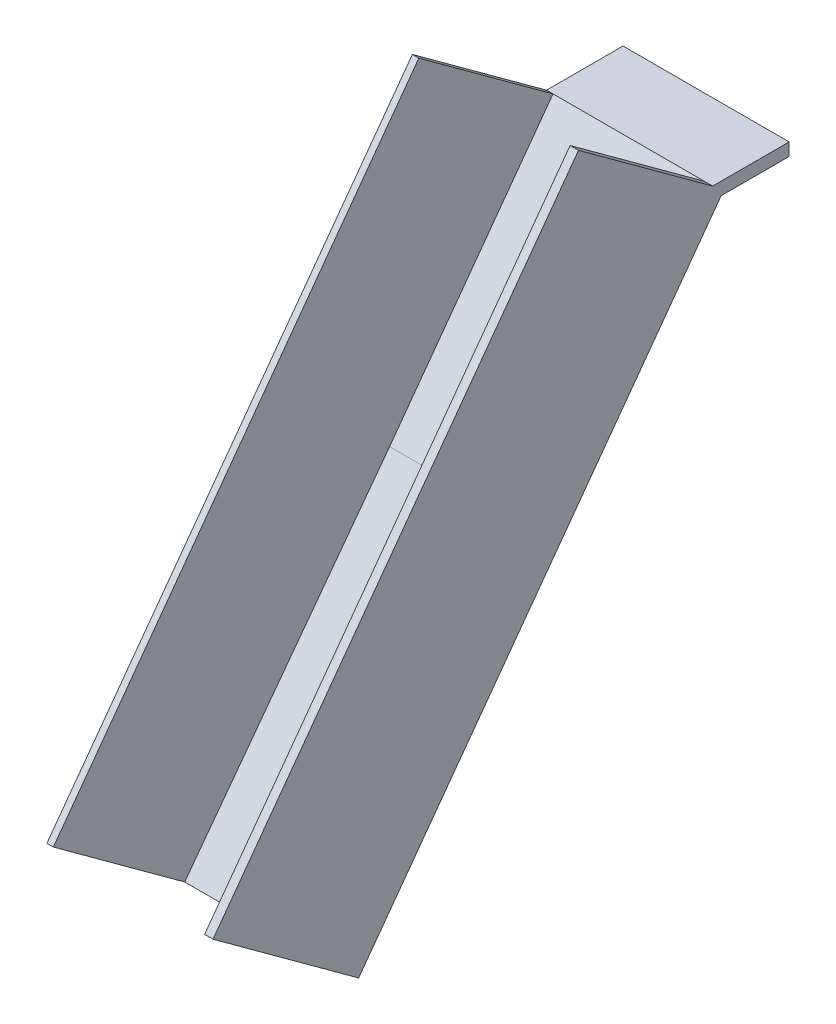
ISO-10303-21;
HEADER;
FILE_DESCRIPTION(('STEP AP214'),'2;1');
FILE_NAME('part.step','',(''),(''),'','','');
FILE_SCHEMA(('AUTOMOTIVE_DESIGN { 1 0 10303 214 1 1 1 1 }'));
ENDSEC;
DATA;
#1=APPLICATION_CONTEXT('core data for automotive mechanical design processes');
#2=APPLICATION_PROTOCOL_DEFINITION('international standard','automotive_design',2000,#1);
#3=PRODUCT_CONTEXT('',#1,'mechanical');
#4=PRODUCT('Part','Part','',(#3));
#5=PRODUCT_RELATED_PRODUCT_CATEGORY('part','',(#4));
#6=PRODUCT_DEFINITION_FORMATION('','',#4);
#7=PRODUCT_DEFINITION_CONTEXT('part definition',#1,'design');
#8=PRODUCT_DEFINITION('design','',#6,#7);
#9=PRODUCT_DEFINITION_SHAPE('','',#8);
#10=(LENGTH_UNIT() NAMED_UNIT(*) SI_UNIT(.MILLI.,.METRE.));
#11=(NAMED_UNIT(*) PLANE_ANGLE_UNIT() SI_UNIT($,.RADIAN.));
#12=(NAMED_UNIT(*) SI_UNIT($,.STERADIAN.) SOLID_ANGLE_UNIT());
#13=UNCERTAINTY_MEASURE_WITH_UNIT(LENGTH_MEASURE(1.E-05),#10,'distance_accuracy_value','');
#14=(GEOMETRIC_REPRESENTATION_CONTEXT(3) GLOBAL_UNCERTAINTY_ASSIGNED_CONTEXT((#13)) GLOBAL_UNIT_ASSIGNED_CONTEXT((#10,
#11,#12)) REPRESENTATION_CONTEXT('',''));
#15=CARTESIAN_POINT('',(0.,0.,0.));
#16=DIRECTION('',(0.,0.,1.));
#17=DIRECTION('',(1.,0.,0.));
#18=AXIS2_PLACEMENT_3D('',#15,#16,#17);
#19=CARTESIAN_POINT('',(40.,0.,0.));
#20=DIRECTION('',(0.,-0.58982616547506,-0.807530243719074));
#21=DIRECTION('',(0.,0.807530243719074,-0.58982616547506));
#22=AXIS2_PLACEMENT_3D('',#19,#20,#21);
#23=PLANE('',#22);
#24=DIRECTION('',(0.,-0.807530243719074,0.58982616547506));
#25=VECTOR('',#24,1.);
#26=CARTESIAN_POINT('',(37.9726991570541,53.8716928385524,-39.3482897535508));
#27=LINE('',#26,#25);
#28=CARTESIAN_POINT('',(37.9726991570541,53.8716928385524,-39.3482897535508));
#29=VERTEX_POINT('',#28);
#30=CARTESIAN_POINT('',(37.9726991570541,0.,0.));
#31=VERTEX_POINT('',#30);
#32=EDGE_CURVE('E53',#29,#31,#27,.T.);
#33=ORIENTED_EDGE('',*,*,#32,.F.);
#34=DIRECTION('',(-1.,0.,0.));
#35=VECTOR('',#34,1.);
#36=CARTESIAN_POINT('',(40.,53.8716928385524,-39.3482897535508));
#37=LINE('',#36,#35);
#38=CARTESIAN_POINT('',(1.56034219795234,53.8716928385524,-39.3482897535508));
#39=VERTEX_POINT('',#38);
#40=EDGE_CURVE('E201',#29,#39,#37,.T.);
#41=ORIENTED_EDGE('',*,*,#40,.T.);
#42=DIRECTION('',(0.,0.807530243719074,-0.58982616547506));
#43=VECTOR('',#42,1.);
#44=CARTESIAN_POINT('',(1.56034219795234,53.8716928385524,-39.3482897535508));
#45=LINE('',#44,#43);
#46=CARTESIAN_POINT('',(1.56034219795234,5.17585974080248E-10,-3.82093662265603E-10));
#47=VERTEX_POINT('',#46);
#48=EDGE_CURVE('E153',#47,#39,#45,.T.);
#49=ORIENTED_EDGE('',*,*,#48,.F.);
#50=DIRECTION('',(-1.,0.,0.));
#51=VECTOR('',#50,1.);
#52=CARTESIAN_POINT('',(40.,0.,0.));
#53=LINE('',#52,#51);
#54=EDGE_CURVE('E194',#31,#47,#53,.T.);
#55=ORIENTED_EDGE('',*,*,#54,.F.);
#56=EDGE_LOOP('',(#33,#41,#49,#55));
#57=FACE_BOUND('',#56,.T.);
#58=ADVANCED_FACE('F39',(#57),#23,.F.);
#59=CARTESIAN_POINT('',(40.,-66.1167171115945,49.3292310317726));
#60=DIRECTION('',(0.,-0.597994068346452,-0.801500526651392));
#61=DIRECTION('',(0.,0.801500526651392,-0.597994068346453));
#62=AXIS2_PLACEMENT_3D('',#59,#60,#61);
#63=PLANE('',#62);
#64=DIRECTION('',(0.,-0.801500526651392,0.597994068346453));
#65=VECTOR('',#64,1.);
#66=CARTESIAN_POINT('',(37.9726991570541,-66.1167171115945,49.3292310317726));
#67=LINE('',#66,#65);
#68=CARTESIAN_POINT('',(37.9726991570541,-66.1167171115945,49.3292310317726));
#69=VERTEX_POINT('',#68);
#70=EDGE_CURVE('E65',#31,#69,#67,.T.);
#71=ORIENTED_EDGE('',*,*,#70,.F.);
#72=ORIENTED_EDGE('',*,*,#54,.T.);
#73=DIRECTION('',(0.,0.801500526651392,-0.597994068346453));
#74=VECTOR('',#73,1.);
#75=CARTESIAN_POINT('',(1.56034219795234,-66.1167171115945,49.3292310317726));
#76=LINE('',#75,#74);
#77=CARTESIAN_POINT('',(1.56034219795234,-66.1167171115945,49.3292310317726));
#78=VERTEX_POINT('',#77);
#79=EDGE_CURVE('E11',#78,#47,#76,.T.);
#80=ORIENTED_EDGE('',*,*,#79,.F.);
#81=DIRECTION('',(-1.,0.,0.));
#82=VECTOR('',#81,1.);
#83=CARTESIAN_POINT('',(40.,-66.1167171115945,49.3292310317726));
#84=LINE('',#83,#82);
#85=EDGE_CURVE('E50',#69,#78,#84,.T.);
#86=ORIENTED_EDGE('',*,*,#85,.F.);
#87=EDGE_LOOP('',(#71,#72,#80,#86));
#88=FACE_BOUND('',#87,.T.);
#89=ADVANCED_FACE('F41',(#88),#63,.F.);
#90=CARTESIAN_POINT('',(40.,-68.6334443146076,45.8835830585487));
#91=DIRECTION('',(0.,0.807530243719074,-0.589826165475061));
#92=DIRECTION('',(0.,0.589826165475061,0.807530243719074));
#93=AXIS2_PLACEMENT_3D('',#90,#91,#92);
#94=PLANE('',#93);
#95=DIRECTION('',(-1.,0.,0.));
#96=VECTOR('',#95,1.);
#97=CARTESIAN_POINT('',(40.,-68.6334443146076,45.8835830585487));
#98=LINE('',#97,#96);
#99=CARTESIAN_POINT('',(40.,-68.6334443146076,45.8835830585487));
#100=VERTEX_POINT('',#99);
#101=CARTESIAN_POINT('',(0.,-68.6334443146076,45.8835830585487));
#102=VERTEX_POINT('',#101);
#103=EDGE_CURVE('E214',#100,#102,#98,.T.);
#104=ORIENTED_EDGE('',*,*,#103,.F.);
#105=DIRECTION('',(0.,-0.589826165475061,-0.807530243719074));
#106=VECTOR('',#105,1.);
#107=CARTESIAN_POINT('',(40.,-68.6334443146076,45.8835830585487));
#108=LINE('',#107,#106);
#109=CARTESIAN_POINT('',(40.,-43.0176358859097,80.9541533965514));
#110=VERTEX_POINT('',#109);
#111=EDGE_CURVE('E181',#110,#100,#108,.T.);
#112=ORIENTED_EDGE('',*,*,#111,.F.);
#113=DIRECTION('',(1.,0.,0.));
#114=VECTOR('',#113,1.);
#115=CARTESIAN_POINT('',(37.9726991570541,-43.0176358859097,80.9541533965514));
#116=LINE('',#115,#114);
#117=CARTESIAN_POINT('',(37.9726991570541,-43.0176358859097,80.9541533965514));
#118=VERTEX_POINT('',#117);
#119=EDGE_CURVE('E144',#118,#110,#116,.T.);
#120=ORIENTED_EDGE('',*,*,#119,.F.);
#121=DIRECTION('',(0.,-0.58982616547506,-0.807530243719074));
#122=VECTOR('',#121,1.);
#123=CARTESIAN_POINT('',(37.9726991570541,-43.0176358859097,80.9541533965514));
#124=LINE('',#123,#122);
#125=EDGE_CURVE('E154',#118,#69,#124,.T.);
#126=ORIENTED_EDGE('',*,*,#125,.T.);
#127=ORIENTED_EDGE('',*,*,#85,.T.);
#128=DIRECTION('',(0.,-0.58982616547506,-0.807530243719074));
#129=VECTOR('',#128,1.);
#130=CARTESIAN_POINT('',(1.56034219795234,-43.0176358859097,80.9541533965514));
#131=LINE('',#130,#129);
#132=CARTESIAN_POINT('',(1.56034219795234,-43.0176358859097,80.9541533965514));
#133=VERTEX_POINT('',#132);
#134=EDGE_CURVE('E176',#133,#78,#131,.T.);
#135=ORIENTED_EDGE('',*,*,#134,.F.);
#136=DIRECTION('',(1.,0.,0.));
#137=VECTOR('',#136,1.);
#138=CARTESIAN_POINT('',(1.56034219795234,-43.0176358859097,80.9541533965514));
#139=LINE('',#138,#137);
#140=CARTESIAN_POINT('',(0.,-43.0176358859097,80.9541533965514));
#141=VERTEX_POINT('',#140);
#142=EDGE_CURVE('E165',#141,#133,#139,.T.);
#143=ORIENTED_EDGE('',*,*,#142,.F.);
#144=DIRECTION('',(0.,-0.589826165475061,-0.807530243719074));
#145=VECTOR('',#144,1.);
#146=CARTESIAN_POINT('',(0.,-68.6334443146076,45.8835830585487));
#147=LINE('',#146,#145);
#148=EDGE_CURVE('E185',#141,#102,#147,.T.);
#149=ORIENTED_EDGE('',*,*,#148,.T.);
#150=EDGE_LOOP('',(#104,#112,#120,#126,#127,#135,#143,#149));
#151=FACE_BOUND('',#150,.T.);
#152=ADVANCED_FACE('F225',(#151),#94,.F.);
#153=CARTESIAN_POINT('',(40.,50.8319107975056,-41.3748111142487));
#154=DIRECTION('',(0.,0.58982616547506,0.807530243719074));
#155=DIRECTION('',(0.,-0.807530243719074,0.58982616547506));
#156=AXIS2_PLACEMENT_3D('',#153,#154,#155);
#157=PLANE('',#156);
#158=DIRECTION('',(0.,0.807530243719074,-0.58982616547506));
#159=VECTOR('',#158,1.);
#160=CARTESIAN_POINT('',(0.,50.8319107975056,-41.3748111142487));
#161=LINE('',#160,#159);
#162=CARTESIAN_POINT('',(0.,50.8319107975056,-41.3748111142487));
#163=VERTEX_POINT('',#162);
#164=EDGE_CURVE('E193',#102,#163,#161,.T.);
#165=ORIENTED_EDGE('',*,*,#164,.T.);
#166=DIRECTION('',(-1.,0.,0.));
#167=VECTOR('',#166,1.);
#168=CARTESIAN_POINT('',(40.,50.8319107975056,-41.3748111142487));
#169=LINE('',#168,#167);
#170=CARTESIAN_POINT('',(40.,50.8319107975056,-41.3748111142487));
#171=VERTEX_POINT('',#170);
#172=EDGE_CURVE('E215',#171,#163,#169,.T.);
#173=ORIENTED_EDGE('',*,*,#172,.F.);
#174=DIRECTION('',(0.,0.807530243719074,-0.58982616547506));
#175=VECTOR('',#174,1.);
#176=CARTESIAN_POINT('',(40.,50.8319107975056,-41.3748111142487));
#177=LINE('',#176,#175);
#178=EDGE_CURVE('E183',#100,#171,#177,.T.);
#179=ORIENTED_EDGE('',*,*,#178,.F.);
#180=ORIENTED_EDGE('',*,*,#103,.T.);
#181=EDGE_LOOP('',(#165,#173,#179,#180));
#182=FACE_BOUND('',#181,.T.);
#183=ADVANCED_FACE('F239',(#182),#157,.F.);
#184=CARTESIAN_POINT('',(40.,50.8319107975056,-57.75585877989));
#185=DIRECTION('',(0.,1.,0.));
#186=DIRECTION('',(0.,0.,1.));
#187=AXIS2_PLACEMENT_3D('',#184,#185,#186);
#188=PLANE('',#187);
#189=DIRECTION('',(0.,0.,-1.));
#190=VECTOR('',#189,1.);
#191=CARTESIAN_POINT('',(0.,50.8319107975056,-57.75585877989));
#192=LINE('',#191,#190);
#193=CARTESIAN_POINT('',(0.,50.8319107975056,-57.75585877989));
#194=VERTEX_POINT('',#193);
#195=EDGE_CURVE('E197',#163,#194,#192,.T.);
#196=ORIENTED_EDGE('',*,*,#195,.T.);
#197=DIRECTION('',(-1.,0.,0.));
#198=VECTOR('',#197,1.);
#199=CARTESIAN_POINT('',(40.,50.8319107975056,-57.75585877989));
#200=LINE('',#199,#198);
#201=CARTESIAN_POINT('',(40.,50.8319107975056,-57.75585877989));
#202=VERTEX_POINT('',#201);
#203=EDGE_CURVE('E207',#202,#194,#200,.T.);
#204=ORIENTED_EDGE('',*,*,#203,.F.);
#205=DIRECTION('',(0.,0.,-1.));
#206=VECTOR('',#205,1.);
#207=CARTESIAN_POINT('',(40.,50.8319107975056,-57.75585877989));
#208=LINE('',#207,#206);
#209=EDGE_CURVE('E189',#171,#202,#208,.T.);
#210=ORIENTED_EDGE('',*,*,#209,.F.);
#211=ORIENTED_EDGE('',*,*,#172,.T.);
#212=EDGE_LOOP('',(#196,#204,#210,#211));
#213=FACE_BOUND('',#212,.T.);
#214=ADVANCED_FACE('F250',(#213),#188,.F.);
#215=CARTESIAN_POINT('',(40.,53.8716928385524,-57.75585877989));
#216=DIRECTION('',(0.,0.,1.));
#217=DIRECTION('',(1.,0.,0.));
#218=AXIS2_PLACEMENT_3D('',#215,#216,#217);
#219=PLANE('',#218);
#220=DIRECTION('',(0.,1.,0.));
#221=VECTOR('',#220,1.);
#222=CARTESIAN_POINT('',(0.,53.8716928385524,-57.75585877989));
#223=LINE('',#222,#221);
#224=CARTESIAN_POINT('',(0.,53.8716928385524,-57.75585877989));
#225=VERTEX_POINT('',#224);
#226=EDGE_CURVE('E200',#194,#225,#223,.T.);
#227=ORIENTED_EDGE('',*,*,#226,.T.);
#228=DIRECTION('',(-1.,0.,0.));
#229=VECTOR('',#228,1.);
#230=CARTESIAN_POINT('',(40.,53.8716928385524,-57.75585877989));
#231=LINE('',#230,#229);
#232=CARTESIAN_POINT('',(40.,53.8716928385524,-57.75585877989));
#233=VERTEX_POINT('',#232);
#234=EDGE_CURVE('E206',#233,#225,#231,.T.);
#235=ORIENTED_EDGE('',*,*,#234,.F.);
#236=DIRECTION('',(0.,1.,0.));
#237=VECTOR('',#236,1.);
#238=CARTESIAN_POINT('',(40.,53.8716928385524,-57.75585877989));
#239=LINE('',#238,#237);
#240=EDGE_CURVE('E188',#202,#233,#239,.T.);
#241=ORIENTED_EDGE('',*,*,#240,.F.);
#242=ORIENTED_EDGE('',*,*,#203,.T.);
#243=EDGE_LOOP('',(#227,#235,#241,#242));
#244=FACE_BOUND('',#243,.T.);
#245=ADVANCED_FACE('F253',(#244),#219,.F.);
#246=CARTESIAN_POINT('',(40.,53.8716928385524,-39.3482897535508));
#247=DIRECTION('',(0.,-1.,0.));
#248=DIRECTION('',(0.,0.,-1.));
#249=AXIS2_PLACEMENT_3D('',#246,#247,#248);
#250=PLANE('',#249);
#251=DIRECTION('',(0.,0.,1.));
#252=VECTOR('',#251,1.);
#253=CARTESIAN_POINT('',(0.,53.8716928385524,-39.3482897535508));
#254=LINE('',#253,#252);
#255=CARTESIAN_POINT('',(0.,53.8716928385524,-39.3482897535508));
#256=VERTEX_POINT('',#255);
#257=EDGE_CURVE('E187',#225,#256,#254,.T.);
#258=ORIENTED_EDGE('',*,*,#257,.T.);
#259=DIRECTION('',(-1.,0.,0.));
#260=VECTOR('',#259,1.);
#261=CARTESIAN_POINT('',(0.,53.8716928385524,-39.3482897535508));
#262=LINE('',#261,#260);
#263=EDGE_CURVE('E162',#39,#256,#262,.T.);
#264=ORIENTED_EDGE('',*,*,#263,.F.);
#265=ORIENTED_EDGE('',*,*,#40,.F.);
#266=CARTESIAN_POINT('',(40.,53.8716928385524,-39.3482897535508));
#267=VERTEX_POINT('',#266);
#268=EDGE_CURVE('E204',#267,#29,#37,.T.);
#269=ORIENTED_EDGE('',*,*,#268,.F.);
#270=DIRECTION('',(0.,0.,1.));
#271=VECTOR('',#270,1.);
#272=CARTESIAN_POINT('',(40.,53.8716928385524,-39.3482897535508));
#273=LINE('',#272,#271);
#274=EDGE_CURVE('E147',#233,#267,#273,.T.);
#275=ORIENTED_EDGE('',*,*,#274,.F.);
#276=ORIENTED_EDGE('',*,*,#234,.T.);
#277=EDGE_LOOP('',(#258,#264,#265,#269,#275,#276));
#278=FACE_BOUND('',#277,.T.);
#279=ADVANCED_FACE('F280',(#278),#250,.F.);
#280=CARTESIAN_POINT('',(40.,0.,0.));
#281=DIRECTION('',(1.,0.,0.));
#282=DIRECTION('',(0.,0.,-1.));
#283=AXIS2_PLACEMENT_3D('',#280,#281,#282);
#284=PLANE('',#283);
#285=DIRECTION('',(0.,0.807530243719074,-0.58982616547506));
#286=VECTOR('',#285,1.);
#287=CARTESIAN_POINT('',(40.,-43.0176358859097,80.9541533965514));
#288=LINE('',#287,#286);
#289=CARTESIAN_POINT('',(40.,77.4647394575548,-7.04708000478788));
#290=VERTEX_POINT('',#289);
#291=EDGE_CURVE('E136',#110,#290,#288,.T.);
#292=ORIENTED_EDGE('',*,*,#291,.F.);
#293=ORIENTED_EDGE('',*,*,#111,.T.);
#294=ORIENTED_EDGE('',*,*,#178,.T.);
#295=ORIENTED_EDGE('',*,*,#209,.T.);
#296=ORIENTED_EDGE('',*,*,#240,.T.);
#297=ORIENTED_EDGE('',*,*,#274,.T.);
#298=DIRECTION('',(0.,-0.58982616547506,-0.807530243719074));
#299=VECTOR('',#298,1.);
#300=CARTESIAN_POINT('',(40.,77.4647394575548,-7.04708000478788));
#301=LINE('',#300,#299);
#302=EDGE_CURVE('E134',#290,#267,#301,.T.);
#303=ORIENTED_EDGE('',*,*,#302,.F.);
#304=EDGE_LOOP('',(#292,#293,#294,#295,#296,#297,#303));
#305=FACE_BOUND('',#304,.T.);
#306=ADVANCED_FACE('F146',(#305),#284,.T.);
#307=CARTESIAN_POINT('',(0.,0.,0.));
#308=DIRECTION('',(1.,0.,0.));
#309=DIRECTION('',(0.,0.,-1.));
#310=AXIS2_PLACEMENT_3D('',#307,#308,#309);
#311=PLANE('',#310);
#312=ORIENTED_EDGE('',*,*,#148,.F.);
#313=DIRECTION('',(0.,-0.807530243719074,0.58982616547506));
#314=VECTOR('',#313,1.);
#315=CARTESIAN_POINT('',(0.,-43.0176358859097,80.9541533965514));
#316=LINE('',#315,#314);
#317=CARTESIAN_POINT('',(0.,77.4647394575548,-7.04708000478788));
#318=VERTEX_POINT('',#317);
#319=EDGE_CURVE('E157',#318,#141,#316,.T.);
#320=ORIENTED_EDGE('',*,*,#319,.F.);
#321=DIRECTION('',(0.,-0.58982616547506,-0.807530243719074));
#322=VECTOR('',#321,1.);
#323=CARTESIAN_POINT('',(0.,77.4647394575548,-7.04708000478788));
#324=LINE('',#323,#322);
#325=EDGE_CURVE('E166',#318,#256,#324,.T.);
#326=ORIENTED_EDGE('',*,*,#325,.T.);
#327=ORIENTED_EDGE('',*,*,#257,.F.);
#328=ORIENTED_EDGE('',*,*,#226,.F.);
#329=ORIENTED_EDGE('',*,*,#195,.F.);
#330=ORIENTED_EDGE('',*,*,#164,.F.);
#331=EDGE_LOOP('',(#312,#320,#326,#327,#328,#329,#330));
#332=FACE_BOUND('',#331,.T.);
#333=ADVANCED_FACE('F245',(#332),#311,.F.);
#334=CARTESIAN_POINT('',(1.56034219795234,77.4647394575548,-7.04708000478788));
#335=DIRECTION('',(-1.,0.,0.));
#336=DIRECTION('',(0.,0.,1.));
#337=AXIS2_PLACEMENT_3D('',#334,#335,#336);
#338=PLANE('',#337);
#339=ORIENTED_EDGE('',*,*,#134,.T.);
#340=ORIENTED_EDGE('',*,*,#79,.T.);
#341=ORIENTED_EDGE('',*,*,#48,.T.);
#342=DIRECTION('',(0.,-0.58982616547506,-0.807530243719074));
#343=VECTOR('',#342,1.);
#344=CARTESIAN_POINT('',(1.56034219795234,77.4647394575548,-7.04708000478788));
#345=LINE('',#344,#343);
#346=CARTESIAN_POINT('',(1.56034219795234,77.4647394575548,-7.04708000478788));
#347=VERTEX_POINT('',#346);
#348=EDGE_CURVE('E177',#347,#39,#345,.T.);
#349=ORIENTED_EDGE('',*,*,#348,.F.);
#350=DIRECTION('',(0.,0.807530243719074,-0.58982616547506));
#351=VECTOR('',#350,1.);
#352=CARTESIAN_POINT('',(1.56034219795234,77.4647394575548,-7.04708000478788));
#353=LINE('',#352,#351);
#354=EDGE_CURVE('E164',#133,#347,#353,.T.);
#355=ORIENTED_EDGE('',*,*,#354,.F.);
#356=EDGE_LOOP('',(#339,#340,#341,#349,#355));
#357=FACE_BOUND('',#356,.T.);
#358=ADVANCED_FACE('F229',(#357),#338,.F.);
#359=CARTESIAN_POINT('',(0.,77.4647394575548,-7.04708000478788));
#360=DIRECTION('',(0.,-0.807530243719074,0.58982616547506));
#361=DIRECTION('',(0.,-0.58982616547506,-0.807530243719074));
#362=AXIS2_PLACEMENT_3D('',#359,#360,#361);
#363=PLANE('',#362);
#364=ORIENTED_EDGE('',*,*,#263,.T.);
#365=ORIENTED_EDGE('',*,*,#325,.F.);
#366=DIRECTION('',(-1.,0.,0.));
#367=VECTOR('',#366,1.);
#368=CARTESIAN_POINT('',(0.,77.4647394575548,-7.04708000478788));
#369=LINE('',#368,#367);
#370=EDGE_CURVE('E170',#347,#318,#369,.T.);
#371=ORIENTED_EDGE('',*,*,#370,.F.);
#372=ORIENTED_EDGE('',*,*,#348,.T.);
#373=EDGE_LOOP('',(#364,#365,#371,#372));
#374=FACE_BOUND('',#373,.T.);
#375=ADVANCED_FACE('F266',(#374),#363,.F.);
#376=CARTESIAN_POINT('',(0.,23.5930466190024,32.301209748763));
#377=DIRECTION('',(0.,-0.589826165475061,-0.807530243719074));
#378=DIRECTION('',(0.,0.807530243719074,-0.58982616547506));
#379=AXIS2_PLACEMENT_3D('',#376,#377,#378);
#380=PLANE('',#379);
#381=ORIENTED_EDGE('',*,*,#319,.T.);
#382=ORIENTED_EDGE('',*,*,#142,.T.);
#383=ORIENTED_EDGE('',*,*,#354,.T.);
#384=ORIENTED_EDGE('',*,*,#370,.T.);
#385=EDGE_LOOP('',(#381,#382,#383,#384));
#386=FACE_BOUND('',#385,.T.);
#387=ADVANCED_FACE('F235',(#386),#380,.F.);
#388=CARTESIAN_POINT('',(37.9726991570541,77.4647394575548,-7.04708000478788));
#389=DIRECTION('',(1.,0.,0.));
#390=DIRECTION('',(0.,0.,-1.));
#391=AXIS2_PLACEMENT_3D('',#388,#389,#390);
#392=PLANE('',#391);
#393=ORIENTED_EDGE('',*,*,#32,.T.);
#394=ORIENTED_EDGE('',*,*,#70,.T.);
#395=ORIENTED_EDGE('',*,*,#125,.F.);
#396=DIRECTION('',(0.,-0.807530243719074,0.58982616547506));
#397=VECTOR('',#396,1.);
#398=CARTESIAN_POINT('',(37.9726991570541,77.4647394575548,-7.04708000478788));
#399=LINE('',#398,#397);
#400=CARTESIAN_POINT('',(37.9726991570541,77.4647394575548,-7.04708000478788));
#401=VERTEX_POINT('',#400);
#402=EDGE_CURVE('E139',#401,#118,#399,.T.);
#403=ORIENTED_EDGE('',*,*,#402,.F.);
#404=DIRECTION('',(0.,-0.58982616547506,-0.807530243719074));
#405=VECTOR('',#404,1.);
#406=CARTESIAN_POINT('',(37.9726991570541,77.4647394575548,-7.04708000478788));
#407=LINE('',#406,#405);
#408=EDGE_CURVE('E133',#401,#29,#407,.T.);
#409=ORIENTED_EDGE('',*,*,#408,.T.);
#410=EDGE_LOOP('',(#393,#394,#395,#403,#409));
#411=FACE_BOUND('',#410,.T.);
#412=ADVANCED_FACE('F260',(#411),#392,.F.);
#413=CARTESIAN_POINT('',(40.,77.4647394575548,-7.04708000478788));
#414=DIRECTION('',(0.,-0.807530243719074,0.58982616547506));
#415=DIRECTION('',(0.,-0.58982616547506,-0.807530243719074));
#416=AXIS2_PLACEMENT_3D('',#413,#414,#415);
#417=PLANE('',#416);
#418=ORIENTED_EDGE('',*,*,#268,.T.);
#419=ORIENTED_EDGE('',*,*,#408,.F.);
#420=DIRECTION('',(-1.,0.,0.));
#421=VECTOR('',#420,1.);
#422=CARTESIAN_POINT('',(40.,77.4647394575548,-7.04708000478788));
#423=LINE('',#422,#421);
#424=EDGE_CURVE('E126',#290,#401,#423,.T.);
#425=ORIENTED_EDGE('',*,*,#424,.F.);
#426=ORIENTED_EDGE('',*,*,#302,.T.);
#427=EDGE_LOOP('',(#418,#419,#425,#426));
#428=FACE_BOUND('',#427,.T.);
#429=ADVANCED_FACE('F132',(#428),#417,.F.);
#430=CARTESIAN_POINT('',(0.,23.5930466190024,32.301209748763));
#431=DIRECTION('',(0.,0.589826165475061,0.807530243719074));
#432=DIRECTION('',(0.,-0.807530243719074,0.58982616547506));
#433=AXIS2_PLACEMENT_3D('',#430,#431,#432);
#434=PLANE('',#433);
#435=ORIENTED_EDGE('',*,*,#291,.T.);
#436=ORIENTED_EDGE('',*,*,#424,.T.);
#437=ORIENTED_EDGE('',*,*,#402,.T.);
#438=ORIENTED_EDGE('',*,*,#119,.T.);
#439=EDGE_LOOP('',(#435,#436,#437,#438));
#440=FACE_BOUND('',#439,.T.);
#441=ADVANCED_FACE('F141',(#440),#434,.T.);
#442=CLOSED_SHELL('',(#58,#89,#152,#183,#214,#245,#279,#306,#333,#358,#375,#387,#412,#429,#441));
#443=MANIFOLD_SOLID_BREP('B2',#442);
#444=ADVANCED_BREP_SHAPE_REPRESENTATION('',(#18,#443),#14);
#445=SHAPE_DEFINITION_REPRESENTATION(#9,#444);
ENDSEC;
END-ISO-10303-21;
